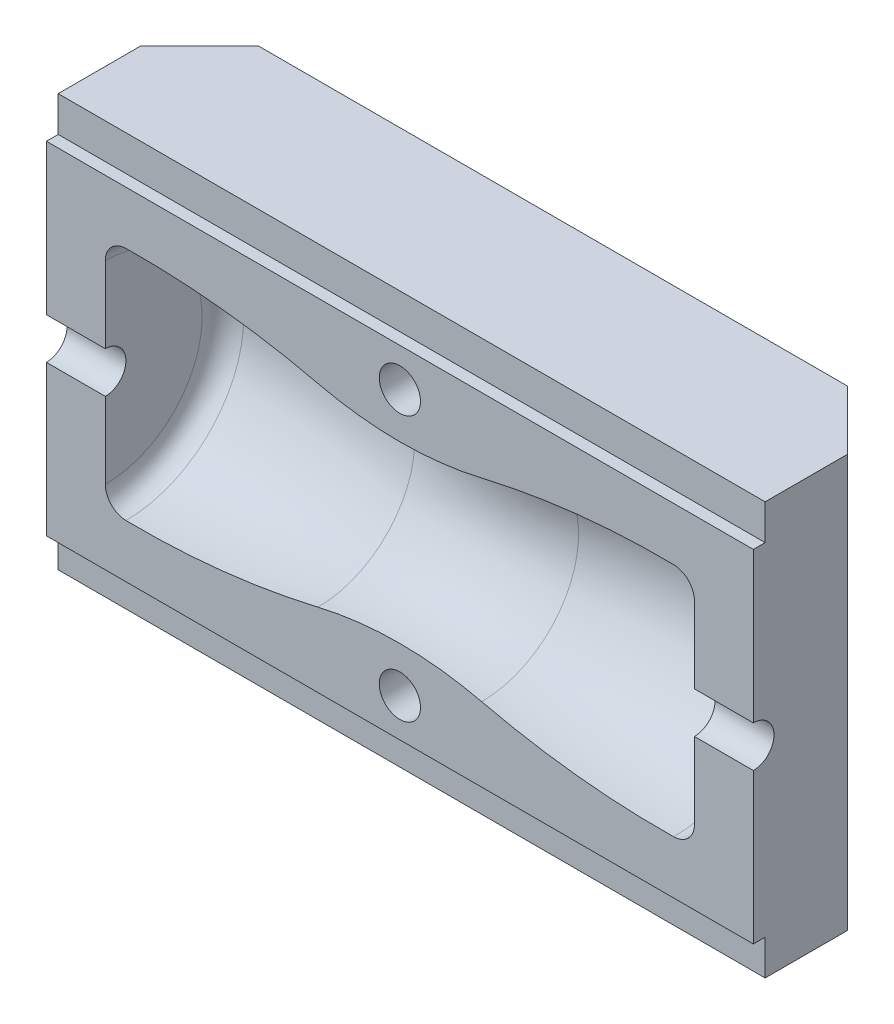
ISO-10303-21;
HEADER;
FILE_DESCRIPTION(('STEP AP214'),'2;1');
FILE_NAME('part.step','',(''),(''),'','','');
FILE_SCHEMA(('AUTOMOTIVE_DESIGN { 1 0 10303 214 1 1 1 1 }'));
ENDSEC;
DATA;
#1=APPLICATION_CONTEXT('core data for automotive mechanical design processes');
#2=APPLICATION_PROTOCOL_DEFINITION('international standard','automotive_design',2000,#1);
#3=PRODUCT_CONTEXT('',#1,'mechanical');
#4=PRODUCT('Part','Part','',(#3));
#5=PRODUCT_RELATED_PRODUCT_CATEGORY('part','',(#4));
#6=PRODUCT_DEFINITION_FORMATION('','',#4);
#7=PRODUCT_DEFINITION_CONTEXT('part definition',#1,'design');
#8=PRODUCT_DEFINITION('design','',#6,#7);
#9=PRODUCT_DEFINITION_SHAPE('','',#8);
#10=(LENGTH_UNIT() NAMED_UNIT(*) SI_UNIT(.MILLI.,.METRE.));
#11=(NAMED_UNIT(*) PLANE_ANGLE_UNIT() SI_UNIT($,.RADIAN.));
#12=(NAMED_UNIT(*) SI_UNIT($,.STERADIAN.) SOLID_ANGLE_UNIT());
#13=UNCERTAINTY_MEASURE_WITH_UNIT(LENGTH_MEASURE(1.E-05),#10,'distance_accuracy_value','');
#14=(GEOMETRIC_REPRESENTATION_CONTEXT(3) GLOBAL_UNCERTAINTY_ASSIGNED_CONTEXT((#13)) GLOBAL_UNIT_ASSIGNED_CONTEXT((#10,
#11,#12)) REPRESENTATION_CONTEXT('',''));
#15=CARTESIAN_POINT('',(0.,0.,0.));
#16=DIRECTION('',(0.,0.,1.));
#17=DIRECTION('',(1.,0.,0.));
#18=AXIS2_PLACEMENT_3D('',#15,#16,#17);
#19=CARTESIAN_POINT('',(0.,-11.25,0.));
#20=DIRECTION('',(0.,0.,1.));
#21=DIRECTION('',(1.,0.,0.));
#22=AXIS2_PLACEMENT_3D('',#19,#20,#21);
#23=CYLINDRICAL_SURFACE('',#22,1.75);
#24=CARTESIAN_POINT('',(0.,-11.25,7.49999999999999));
#25=DIRECTION('',(0.,0.,-1.));
#26=DIRECTION('',(-1.,0.,0.));
#27=AXIS2_PLACEMENT_3D('',#24,#25,#26);
#28=CIRCLE('',#27,1.75);
#29=CARTESIAN_POINT('',(1.75,-11.25,7.49999999999999));
#30=VERTEX_POINT('',#29);
#31=EDGE_CURVE('E349',#30,#30,#28,.T.);
#32=CARTESIAN_POINT('',(0.,-11.25,13.));
#33=DIRECTION('',(0.,0.,1.));
#34=DIRECTION('',(1.,0.,0.));
#35=AXIS2_PLACEMENT_3D('',#32,#33,#34);
#36=CIRCLE('',#35,1.75);
#37=CARTESIAN_POINT('',(1.75,-11.25,13.));
#38=VERTEX_POINT('',#37);
#39=EDGE_CURVE('E791',#38,#38,#36,.T.);
#40=CARTESIAN_POINT('',(1.75,-11.25,7.49999999999999));
#41=CARTESIAN_POINT('',(1.75,-11.25,7.55729166666665));
#42=CARTESIAN_POINT('',(1.75,-11.25,7.61458333333332));
#43=CARTESIAN_POINT('',(1.75,-11.25,7.72916666666665));
#44=CARTESIAN_POINT('',(1.75,-11.25,7.78645833333332));
#45=CARTESIAN_POINT('',(1.75,-11.25,7.90104166666665));
#46=CARTESIAN_POINT('',(1.75,-11.25,7.95833333333332));
#47=CARTESIAN_POINT('',(1.75,-11.25,8.07291666666665));
#48=CARTESIAN_POINT('',(1.75,-11.25,8.13020833333332));
#49=CARTESIAN_POINT('',(1.75,-11.25,8.24479166666666));
#50=CARTESIAN_POINT('',(1.75,-11.25,8.30208333333332));
#51=CARTESIAN_POINT('',(1.75,-11.25,8.41666666666666));
#52=CARTESIAN_POINT('',(1.75,-11.25,8.47395833333332));
#53=CARTESIAN_POINT('',(1.75,-11.25,8.58854166666666));
#54=CARTESIAN_POINT('',(1.75,-11.25,8.64583333333332));
#55=CARTESIAN_POINT('',(1.75,-11.25,8.76041666666666));
#56=CARTESIAN_POINT('',(1.75,-11.25,8.81770833333332));
#57=CARTESIAN_POINT('',(1.75,-11.25,8.93229166666666));
#58=CARTESIAN_POINT('',(1.75,-11.25,8.98958333333332));
#59=CARTESIAN_POINT('',(1.75,-11.25,9.10416666666666));
#60=CARTESIAN_POINT('',(1.75,-11.25,9.16145833333332));
#61=CARTESIAN_POINT('',(1.75,-11.25,9.27604166666666));
#62=CARTESIAN_POINT('',(1.75,-11.25,9.33333333333332));
#63=CARTESIAN_POINT('',(1.75,-11.25,9.44791666666666));
#64=CARTESIAN_POINT('',(1.75,-11.25,9.50520833333332));
#65=CARTESIAN_POINT('',(1.75,-11.25,9.61979166666666));
#66=CARTESIAN_POINT('',(1.75,-11.25,9.67708333333332));
#67=CARTESIAN_POINT('',(1.75,-11.25,9.79166666666666));
#68=CARTESIAN_POINT('',(1.75,-11.25,9.84895833333333));
#69=CARTESIAN_POINT('',(1.75,-11.25,9.96354166666666));
#70=CARTESIAN_POINT('',(1.75,-11.25,10.0208333333333));
#71=CARTESIAN_POINT('',(1.75,-11.25,10.1354166666667));
#72=CARTESIAN_POINT('',(1.75,-11.25,10.1927083333333));
#73=CARTESIAN_POINT('',(1.75,-11.25,10.3072916666667));
#74=CARTESIAN_POINT('',(1.75,-11.25,10.3645833333333));
#75=CARTESIAN_POINT('',(1.75,-11.25,10.4791666666667));
#76=CARTESIAN_POINT('',(1.75,-11.25,10.5364583333333));
#77=CARTESIAN_POINT('',(1.75,-11.25,10.6510416666667));
#78=CARTESIAN_POINT('',(1.75,-11.25,10.7083333333333));
#79=CARTESIAN_POINT('',(1.75,-11.25,10.8229166666667));
#80=CARTESIAN_POINT('',(1.75,-11.25,10.8802083333333));
#81=CARTESIAN_POINT('',(1.75,-11.25,10.9947916666667));
#82=CARTESIAN_POINT('',(1.75,-11.25,11.0520833333333));
#83=CARTESIAN_POINT('',(1.75,-11.25,11.1666666666667));
#84=CARTESIAN_POINT('',(1.75,-11.25,11.2239583333333));
#85=CARTESIAN_POINT('',(1.75,-11.25,11.3385416666667));
#86=CARTESIAN_POINT('',(1.75,-11.25,11.3958333333333));
#87=CARTESIAN_POINT('',(1.75,-11.25,11.5104166666667));
#88=CARTESIAN_POINT('',(1.75,-11.25,11.5677083333333));
#89=CARTESIAN_POINT('',(1.75,-11.25,11.6822916666667));
#90=CARTESIAN_POINT('',(1.75,-11.25,11.7395833333333));
#91=CARTESIAN_POINT('',(1.75,-11.25,11.8541666666667));
#92=CARTESIAN_POINT('',(1.75,-11.25,11.9114583333333));
#93=CARTESIAN_POINT('',(1.75,-11.25,12.0260416666667));
#94=CARTESIAN_POINT('',(1.75,-11.25,12.0833333333333));
#95=CARTESIAN_POINT('',(1.75,-11.25,12.1979166666667));
#96=CARTESIAN_POINT('',(1.75,-11.25,12.2552083333333));
#97=CARTESIAN_POINT('',(1.75,-11.25,12.3697916666667));
#98=CARTESIAN_POINT('',(1.75,-11.25,12.4270833333333));
#99=CARTESIAN_POINT('',(1.75,-11.25,12.5416666666667));
#100=CARTESIAN_POINT('',(1.75,-11.25,12.5989583333333));
#101=CARTESIAN_POINT('',(1.75,-11.25,12.7135416666667));
#102=CARTESIAN_POINT('',(1.75,-11.25,12.7708333333333));
#103=CARTESIAN_POINT('',(1.75,-11.25,12.8854166666667));
#104=CARTESIAN_POINT('',(1.75,-11.25,12.9427083333333));
#105=CARTESIAN_POINT('',(1.75,-11.25,13.));
#106=B_SPLINE_CURVE_WITH_KNOTS('',3,(#40,#41,#42,#43,#44,#45,#46,#47,#48,#49,#50,#51,#52,#53,
#54,#55,#56,#57,#58,#59,#60,#61,#62,#63,#64,#65,#66,#67,#68,#69,#70,#71,#72,#73,#74,#75,#76,#77,
#78,#79,#80,#81,#82,#83,#84,#85,#86,#87,#88,#89,#90,#91,#92,#93,#94,#95,#96,#97,#98,#99,#100,
#101,#102,#103,#104,#105),.UNSPECIFIED.,.F.,.F.,(4,2,2,2,2,2,2,2,2,2,2,2,2,2,2,2,2,2,2,2,2,2,2,
2,2,2,2,2,2,2,2,2,4),(0.,0.171875,0.343749999999999,0.515625,0.687500000000001,
0.859375000000002,1.03125,1.203125,1.375,1.546875,1.71875,1.890625,2.0625,2.234375,2.40625,
2.578125,2.75000000000001,2.92187500000001,3.09375000000001,3.26562500000001,3.43750000000001,
3.60937500000001,3.78125000000001,3.95312500000001,4.12500000000001,4.29687500000001,
4.46875000000001,4.64062500000001,4.81250000000001,4.98437500000001,5.15625000000001,
5.32812500000001,5.50000000000001),.UNSPECIFIED.);
#107=EDGE_CURVE('BSEAM39',#30,#38,#106,.T.);
#108=ORIENTED_EDGE('',*,*,#31,.T.);
#109=ORIENTED_EDGE('',*,*,#39,.T.);
#110=ORIENTED_EDGE('',*,*,#107,.T.);
#111=ORIENTED_EDGE('',*,*,#107,.F.);
#112=EDGE_LOOP('',(#108,#110,#109,#111));
#113=FACE_BOUND('',#112,.T.);
#114=ADVANCED_FACE('F39',(#113),#23,.F.);
#115=CARTESIAN_POINT('',(0.,11.25,0.));
#116=DIRECTION('',(0.,0.,1.));
#117=DIRECTION('',(1.,0.,0.));
#118=AXIS2_PLACEMENT_3D('',#115,#116,#117);
#119=CYLINDRICAL_SURFACE('',#118,1.75);
#120=CARTESIAN_POINT('',(0.,11.25,7.49999999999999));
#121=DIRECTION('',(0.,0.,-1.));
#122=DIRECTION('',(-1.,0.,0.));
#123=AXIS2_PLACEMENT_3D('',#120,#121,#122);
#124=CIRCLE('',#123,1.75);
#125=CARTESIAN_POINT('',(1.75,11.25,7.49999999999999));
#126=VERTEX_POINT('',#125);
#127=EDGE_CURVE('E334',#126,#126,#124,.T.);
#128=CARTESIAN_POINT('',(0.,11.25,13.));
#129=DIRECTION('',(0.,0.,1.));
#130=DIRECTION('',(1.,0.,0.));
#131=AXIS2_PLACEMENT_3D('',#128,#129,#130);
#132=CIRCLE('',#131,1.75);
#133=CARTESIAN_POINT('',(1.75,11.25,13.));
#134=VERTEX_POINT('',#133);
#135=EDGE_CURVE('E217',#134,#134,#132,.T.);
#136=CARTESIAN_POINT('',(1.75,11.25,7.49999999999999));
#137=CARTESIAN_POINT('',(1.75,11.25,7.55729166666665));
#138=CARTESIAN_POINT('',(1.75,11.25,7.61458333333332));
#139=CARTESIAN_POINT('',(1.75,11.25,7.72916666666665));
#140=CARTESIAN_POINT('',(1.75,11.25,7.78645833333332));
#141=CARTESIAN_POINT('',(1.75,11.25,7.90104166666665));
#142=CARTESIAN_POINT('',(1.75,11.25,7.95833333333332));
#143=CARTESIAN_POINT('',(1.75,11.25,8.07291666666665));
#144=CARTESIAN_POINT('',(1.75,11.25,8.13020833333332));
#145=CARTESIAN_POINT('',(1.75,11.25,8.24479166666666));
#146=CARTESIAN_POINT('',(1.75,11.25,8.30208333333332));
#147=CARTESIAN_POINT('',(1.75,11.25,8.41666666666666));
#148=CARTESIAN_POINT('',(1.75,11.25,8.47395833333332));
#149=CARTESIAN_POINT('',(1.75,11.25,8.58854166666666));
#150=CARTESIAN_POINT('',(1.75,11.25,8.64583333333332));
#151=CARTESIAN_POINT('',(1.75,11.25,8.76041666666666));
#152=CARTESIAN_POINT('',(1.75,11.25,8.81770833333332));
#153=CARTESIAN_POINT('',(1.75,11.25,8.93229166666666));
#154=CARTESIAN_POINT('',(1.75,11.25,8.98958333333332));
#155=CARTESIAN_POINT('',(1.75,11.25,9.10416666666666));
#156=CARTESIAN_POINT('',(1.75,11.25,9.16145833333332));
#157=CARTESIAN_POINT('',(1.75,11.25,9.27604166666666));
#158=CARTESIAN_POINT('',(1.75,11.25,9.33333333333332));
#159=CARTESIAN_POINT('',(1.75,11.25,9.44791666666666));
#160=CARTESIAN_POINT('',(1.75,11.25,9.50520833333332));
#161=CARTESIAN_POINT('',(1.75,11.25,9.61979166666666));
#162=CARTESIAN_POINT('',(1.75,11.25,9.67708333333332));
#163=CARTESIAN_POINT('',(1.75,11.25,9.79166666666666));
#164=CARTESIAN_POINT('',(1.75,11.25,9.84895833333333));
#165=CARTESIAN_POINT('',(1.75,11.25,9.96354166666666));
#166=CARTESIAN_POINT('',(1.75,11.25,10.0208333333333));
#167=CARTESIAN_POINT('',(1.75,11.25,10.1354166666667));
#168=CARTESIAN_POINT('',(1.75,11.25,10.1927083333333));
#169=CARTESIAN_POINT('',(1.75,11.25,10.3072916666667));
#170=CARTESIAN_POINT('',(1.75,11.25,10.3645833333333));
#171=CARTESIAN_POINT('',(1.75,11.25,10.4791666666667));
#172=CARTESIAN_POINT('',(1.75,11.25,10.5364583333333));
#173=CARTESIAN_POINT('',(1.75,11.25,10.6510416666667));
#174=CARTESIAN_POINT('',(1.75,11.25,10.7083333333333));
#175=CARTESIAN_POINT('',(1.75,11.25,10.8229166666667));
#176=CARTESIAN_POINT('',(1.75,11.25,10.8802083333333));
#177=CARTESIAN_POINT('',(1.75,11.25,10.9947916666667));
#178=CARTESIAN_POINT('',(1.75,11.25,11.0520833333333));
#179=CARTESIAN_POINT('',(1.75,11.25,11.1666666666667));
#180=CARTESIAN_POINT('',(1.75,11.25,11.2239583333333));
#181=CARTESIAN_POINT('',(1.75,11.25,11.3385416666667));
#182=CARTESIAN_POINT('',(1.75,11.25,11.3958333333333));
#183=CARTESIAN_POINT('',(1.75,11.25,11.5104166666667));
#184=CARTESIAN_POINT('',(1.75,11.25,11.5677083333333));
#185=CARTESIAN_POINT('',(1.75,11.25,11.6822916666667));
#186=CARTESIAN_POINT('',(1.75,11.25,11.7395833333333));
#187=CARTESIAN_POINT('',(1.75,11.25,11.8541666666667));
#188=CARTESIAN_POINT('',(1.75,11.25,11.9114583333333));
#189=CARTESIAN_POINT('',(1.75,11.25,12.0260416666667));
#190=CARTESIAN_POINT('',(1.75,11.25,12.0833333333333));
#191=CARTESIAN_POINT('',(1.75,11.25,12.1979166666667));
#192=CARTESIAN_POINT('',(1.75,11.25,12.2552083333333));
#193=CARTESIAN_POINT('',(1.75,11.25,12.3697916666667));
#194=CARTESIAN_POINT('',(1.75,11.25,12.4270833333333));
#195=CARTESIAN_POINT('',(1.75,11.25,12.5416666666667));
#196=CARTESIAN_POINT('',(1.75,11.25,12.5989583333333));
#197=CARTESIAN_POINT('',(1.75,11.25,12.7135416666667));
#198=CARTESIAN_POINT('',(1.75,11.25,12.7708333333333));
#199=CARTESIAN_POINT('',(1.75,11.25,12.8854166666667));
#200=CARTESIAN_POINT('',(1.75,11.25,12.9427083333333));
#201=CARTESIAN_POINT('',(1.75,11.25,13.));
#202=B_SPLINE_CURVE_WITH_KNOTS('',3,(#136,#137,#138,#139,#140,#141,#142,#143,#144,#145,#146,
#147,#148,#149,#150,#151,#152,#153,#154,#155,#156,#157,#158,#159,#160,#161,#162,#163,#164,#165,
#166,#167,#168,#169,#170,#171,#172,#173,#174,#175,#176,#177,#178,#179,#180,#181,#182,#183,#184,
#185,#186,#187,#188,#189,#190,#191,#192,#193,#194,#195,#196,#197,#198,#199,#200,#201),
.UNSPECIFIED.,.F.,.F.,(4,2,2,2,2,2,2,2,2,2,2,2,2,2,2,2,2,2,2,2,2,2,2,2,2,2,2,2,2,2,2,2,4),(0.,
0.171875,0.343749999999999,0.515625,0.687500000000001,0.859375000000002,1.03125,1.203125,1.375,
1.546875,1.71875,1.890625,2.0625,2.234375,2.40625,2.578125,2.75000000000001,2.92187500000001,
3.09375000000001,3.26562500000001,3.43750000000001,3.60937500000001,3.78125000000001,
3.95312500000001,4.12500000000001,4.29687500000001,4.46875000000001,4.64062500000001,
4.81250000000001,4.98437500000001,5.15625000000001,5.32812500000001,5.50000000000001),.UNSPECIFIED.);
#203=EDGE_CURVE('BSEAM385',#126,#134,#202,.T.);
#204=ORIENTED_EDGE('',*,*,#127,.T.);
#205=ORIENTED_EDGE('',*,*,#135,.T.);
#206=ORIENTED_EDGE('',*,*,#203,.T.);
#207=ORIENTED_EDGE('',*,*,#203,.F.);
#208=EDGE_LOOP('',(#204,#206,#205,#207));
#209=FACE_BOUND('',#208,.T.);
#210=ADVANCED_FACE('F385',(#209),#119,.F.);
#211=CARTESIAN_POINT('',(-30.,17.5,13.));
#212=DIRECTION('',(0.,-1.,0.));
#213=DIRECTION('',(0.,0.,-1.));
#214=AXIS2_PLACEMENT_3D('',#211,#212,#213);
#215=PLANE('',#214);
#216=DIRECTION('',(0.,0.,-1.));
#217=VECTOR('',#216,1.);
#218=CARTESIAN_POINT('',(30.,17.5,13.));
#219=LINE('',#218,#217);
#220=CARTESIAN_POINT('',(30.,17.5,12.));
#221=VERTEX_POINT('',#220);
#222=CARTESIAN_POINT('',(30.,17.5,5.00000000000001));
#223=VERTEX_POINT('',#222);
#224=EDGE_CURVE('E278',#221,#223,#219,.T.);
#225=ORIENTED_EDGE('',*,*,#224,.T.);
#226=DIRECTION('',(0.707106781186549,0.,0.707106781186546));
#227=VECTOR('',#226,1.);
#228=CARTESIAN_POINT('',(30.,17.5,5.));
#229=LINE('',#228,#227);
#230=CARTESIAN_POINT('',(25.,17.5,0.));
#231=VERTEX_POINT('',#230);
#232=EDGE_CURVE('E318',#223,#231,#229,.F.);
#233=ORIENTED_EDGE('',*,*,#232,.T.);
#234=DIRECTION('',(-1.,0.,0.));
#235=VECTOR('',#234,1.);
#236=CARTESIAN_POINT('',(-30.,17.5,0.));
#237=LINE('',#236,#235);
#238=CARTESIAN_POINT('',(-25.,17.5,0.));
#239=VERTEX_POINT('',#238);
#240=EDGE_CURVE('E260',#231,#239,#237,.T.);
#241=ORIENTED_EDGE('',*,*,#240,.T.);
#242=DIRECTION('',(0.707106781186548,0.,-0.707106781186547));
#243=VECTOR('',#242,1.);
#244=CARTESIAN_POINT('',(-30.,17.5,5.));
#245=LINE('',#244,#243);
#246=CARTESIAN_POINT('',(-30.,17.5,5.00000000000001));
#247=VERTEX_POINT('',#246);
#248=EDGE_CURVE('E316',#239,#247,#245,.F.);
#249=ORIENTED_EDGE('',*,*,#248,.T.);
#250=DIRECTION('',(0.,0.,-1.));
#251=VECTOR('',#250,1.);
#252=CARTESIAN_POINT('',(-30.,17.5,13.));
#253=LINE('',#252,#251);
#254=CARTESIAN_POINT('',(-30.,17.5,12.));
#255=VERTEX_POINT('',#254);
#256=EDGE_CURVE('E276',#255,#247,#253,.T.);
#257=ORIENTED_EDGE('',*,*,#256,.F.);
#258=DIRECTION('',(-1.,0.,0.));
#259=VECTOR('',#258,1.);
#260=CARTESIAN_POINT('',(-30.,17.5,12.));
#261=LINE('',#260,#259);
#262=EDGE_CURVE('E195',#221,#255,#261,.T.);
#263=ORIENTED_EDGE('',*,*,#262,.F.);
#264=EDGE_LOOP('',(#225,#233,#241,#249,#257,#263));
#265=FACE_BOUND('',#264,.T.);
#266=ADVANCED_FACE('F392',(#265),#215,.F.);
#267=CARTESIAN_POINT('',(-30.,-17.5,13.));
#268=DIRECTION('',(0.,1.,0.));
#269=DIRECTION('',(0.,0.,1.));
#270=AXIS2_PLACEMENT_3D('',#267,#268,#269);
#271=PLANE('',#270);
#272=DIRECTION('',(1.,0.,0.));
#273=VECTOR('',#272,1.);
#274=CARTESIAN_POINT('',(-30.,-17.5,0.));
#275=LINE('',#274,#273);
#276=CARTESIAN_POINT('',(-25.,-17.5,0.));
#277=VERTEX_POINT('',#276);
#278=CARTESIAN_POINT('',(25.,-17.5,0.));
#279=VERTEX_POINT('',#278);
#280=EDGE_CURVE('E269',#277,#279,#275,.T.);
#281=ORIENTED_EDGE('',*,*,#280,.T.);
#282=DIRECTION('',(-0.707106781186549,0.,-0.707106781186546));
#283=VECTOR('',#282,1.);
#284=CARTESIAN_POINT('',(30.,-17.5,5.));
#285=LINE('',#284,#283);
#286=CARTESIAN_POINT('',(30.,-17.5,5.00000000000001));
#287=VERTEX_POINT('',#286);
#288=EDGE_CURVE('E324',#279,#287,#285,.F.);
#289=ORIENTED_EDGE('',*,*,#288,.T.);
#290=DIRECTION('',(0.,0.,-1.));
#291=VECTOR('',#290,1.);
#292=CARTESIAN_POINT('',(30.,-17.5,13.));
#293=LINE('',#292,#291);
#294=CARTESIAN_POINT('',(30.,-17.5,12.));
#295=VERTEX_POINT('',#294);
#296=EDGE_CURVE('E266',#295,#287,#293,.T.);
#297=ORIENTED_EDGE('',*,*,#296,.F.);
#298=DIRECTION('',(1.,0.,0.));
#299=VECTOR('',#298,1.);
#300=CARTESIAN_POINT('',(30.,-17.5,12.));
#301=LINE('',#300,#299);
#302=CARTESIAN_POINT('',(-30.,-17.5,12.));
#303=VERTEX_POINT('',#302);
#304=EDGE_CURVE('E213',#303,#295,#301,.T.);
#305=ORIENTED_EDGE('',*,*,#304,.F.);
#306=DIRECTION('',(0.,0.,-1.));
#307=VECTOR('',#306,1.);
#308=CARTESIAN_POINT('',(-30.,-17.5,13.));
#309=LINE('',#308,#307);
#310=CARTESIAN_POINT('',(-30.,-17.5,5.00000000000001));
#311=VERTEX_POINT('',#310);
#312=EDGE_CURVE('E273',#303,#311,#309,.T.);
#313=ORIENTED_EDGE('',*,*,#312,.T.);
#314=DIRECTION('',(-0.707106781186548,0.,0.707106781186547));
#315=VECTOR('',#314,1.);
#316=CARTESIAN_POINT('',(-30.,-17.5,5.));
#317=LINE('',#316,#315);
#318=EDGE_CURVE('E55',#311,#277,#317,.F.);
#319=ORIENTED_EDGE('',*,*,#318,.T.);
#320=EDGE_LOOP('',(#281,#289,#297,#305,#313,#319));
#321=FACE_BOUND('',#320,.T.);
#322=ADVANCED_FACE('F451',(#321),#271,.F.);
#323=CARTESIAN_POINT('',(0.,0.,13.));
#324=DIRECTION('',(0.,0.,1.));
#325=DIRECTION('',(1.,0.,0.));
#326=AXIS2_PLACEMENT_3D('',#323,#324,#325);
#327=PLANE('',#326);
#328=ORIENTED_EDGE('',*,*,#39,.F.);
#329=EDGE_LOOP('',(#328));
#330=FACE_BOUND('',#329,.T.);
#331=DIRECTION('',(-1.,0.,0.));
#332=VECTOR('',#331,1.);
#333=CARTESIAN_POINT('',(30.,-14.5,13.));
#334=LINE('',#333,#332);
#335=CARTESIAN_POINT('',(30.,-14.5,13.));
#336=VERTEX_POINT('',#335);
#337=CARTESIAN_POINT('',(-30.,-14.5,13.));
#338=VERTEX_POINT('',#337);
#339=EDGE_CURVE('E218',#336,#338,#334,.T.);
#340=ORIENTED_EDGE('',*,*,#339,.F.);
#341=DIRECTION('',(0.,1.,0.));
#342=VECTOR('',#341,1.);
#343=CARTESIAN_POINT('',(30.,17.5,13.));
#344=LINE('',#343,#342);
#345=CARTESIAN_POINT('',(30.,-1.75000000000001,13.));
#346=VERTEX_POINT('',#345);
#347=EDGE_CURVE('E261',#336,#346,#344,.T.);
#348=ORIENTED_EDGE('',*,*,#347,.T.);
#349=DIRECTION('',(1.,0.,0.));
#350=VECTOR('',#349,1.);
#351=CARTESIAN_POINT('',(-30.,-1.75000000000002,13.));
#352=LINE('',#351,#350);
#353=CARTESIAN_POINT('',(25.,-1.75000000000001,13.));
#354=VERTEX_POINT('',#353);
#355=EDGE_CURVE('E234',#354,#346,#352,.T.);
#356=ORIENTED_EDGE('',*,*,#355,.F.);
#357=DIRECTION('',(0.,1.,0.));
#358=VECTOR('',#357,1.);
#359=CARTESIAN_POINT('',(25.,0.,13.));
#360=LINE('',#359,#358);
#361=CARTESIAN_POINT('',(25.,-8.21812745520263,13.));
#362=VERTEX_POINT('',#361);
#363=EDGE_CURVE('E282',#362,#354,#360,.T.);
#364=ORIENTED_EDGE('',*,*,#363,.F.);
#365=CARTESIAN_POINT('',(23.217947805922,-8.21812745520263,13.));
#366=DIRECTION('',(0.,0.,1.));
#367=DIRECTION('',(1.,0.,0.));
#368=AXIS2_PLACEMENT_3D('',#365,#366,#367);
#369=CIRCLE('',#368,1.782052194078);
#370=CARTESIAN_POINT('',(23.2432510965285,-10.,13.));
#371=VERTEX_POINT('',#370);
#372=EDGE_CURVE('E287',#371,#362,#369,.T.);
#373=ORIENTED_EDGE('',*,*,#372,.F.);
#374=CARTESIAN_POINT('',(22.2956280625294,56.7321690826381,13.));
#375=DIRECTION('',(0.,0.,1.));
#376=DIRECTION('',(1.,0.,0.));
#377=AXIS2_PLACEMENT_3D('',#374,#375,#376);
#378=CIRCLE('',#377,66.7388970532805);
#379=CARTESIAN_POINT('',(6.94833645993956,-8.21812745520262,13.));
#380=VERTEX_POINT('',#379);
#381=EDGE_CURVE('E292',#380,#371,#378,.T.);
#382=ORIENTED_EDGE('',*,*,#381,.F.);
#383=CARTESIAN_POINT('',(0.,-37.6237401980803,13.));
#384=DIRECTION('',(0.,0.,1.));
#385=DIRECTION('',(1.,0.,0.));
#386=AXIS2_PLACEMENT_3D('',#383,#384,#385);
#387=CIRCLE('',#386,30.2153841667555);
#388=CARTESIAN_POINT('',(-6.94833645993959,-8.21812745520262,13.));
#389=VERTEX_POINT('',#388);
#390=EDGE_CURVE('E296',#389,#380,#387,.F.);
#391=ORIENTED_EDGE('',*,*,#390,.F.);
#392=CARTESIAN_POINT('',(-22.2956280625294,56.7321690826381,13.));
#393=DIRECTION('',(0.,0.,1.));
#394=DIRECTION('',(1.,0.,0.));
#395=AXIS2_PLACEMENT_3D('',#392,#393,#394);
#396=CIRCLE('',#395,66.7388970532805);
#397=CARTESIAN_POINT('',(-23.2432510965285,-10.,13.));
#398=VERTEX_POINT('',#397);
#399=EDGE_CURVE('E300',#398,#389,#396,.T.);
#400=ORIENTED_EDGE('',*,*,#399,.F.);
#401=CARTESIAN_POINT('',(-23.217947805922,-8.21812745520263,13.));
#402=DIRECTION('',(0.,0.,1.));
#403=DIRECTION('',(1.,0.,0.));
#404=AXIS2_PLACEMENT_3D('',#401,#402,#403);
#405=CIRCLE('',#404,1.782052194078);
#406=CARTESIAN_POINT('',(-25.,-8.21812745520263,13.));
#407=VERTEX_POINT('',#406);
#408=EDGE_CURVE('E304',#407,#398,#405,.T.);
#409=ORIENTED_EDGE('',*,*,#408,.F.);
#410=DIRECTION('',(0.,-1.,0.));
#411=VECTOR('',#410,1.);
#412=CARTESIAN_POINT('',(-25.,0.,13.));
#413=LINE('',#412,#411);
#414=CARTESIAN_POINT('',(-25.,-1.75000000000002,13.));
#415=VERTEX_POINT('',#414);
#416=EDGE_CURVE('E306',#415,#407,#413,.T.);
#417=ORIENTED_EDGE('',*,*,#416,.F.);
#418=CARTESIAN_POINT('',(-30.,-1.75000000000002,13.));
#419=VERTEX_POINT('',#418);
#420=EDGE_CURVE('E239',#419,#415,#352,.T.);
#421=ORIENTED_EDGE('',*,*,#420,.F.);
#422=DIRECTION('',(0.,-1.,0.));
#423=VECTOR('',#422,1.);
#424=CARTESIAN_POINT('',(-30.,17.5,13.));
#425=LINE('',#424,#423);
#426=EDGE_CURVE('E263',#419,#338,#425,.T.);
#427=ORIENTED_EDGE('',*,*,#426,.T.);
#428=EDGE_LOOP('',(#340,#348,#356,#364,#373,#382,#391,#400,#409,#417,#421,#427));
#429=FACE_BOUND('',#428,.T.);
#430=ADVANCED_FACE('F447',(#330,#429),#327,.T.);
#431=CARTESIAN_POINT('',(30.,17.5,13.));
#432=DIRECTION('',(-1.,0.,0.));
#433=DIRECTION('',(0.,-1.,0.));
#434=AXIS2_PLACEMENT_3D('',#431,#432,#433);
#435=PLANE('',#434);
#436=ORIENTED_EDGE('',*,*,#296,.T.);
#437=DIRECTION('',(0.,1.,0.));
#438=VECTOR('',#437,1.);
#439=CARTESIAN_POINT('',(30.,17.5,5.));
#440=LINE('',#439,#438);
#441=EDGE_CURVE('E313',#287,#223,#440,.T.);
#442=ORIENTED_EDGE('',*,*,#441,.T.);
#443=ORIENTED_EDGE('',*,*,#224,.F.);
#444=DIRECTION('',(0.,1.,0.));
#445=VECTOR('',#444,1.);
#446=CARTESIAN_POINT('',(30.,17.5,12.));
#447=LINE('',#446,#445);
#448=CARTESIAN_POINT('',(30.,14.5,12.));
#449=VERTEX_POINT('',#448);
#450=EDGE_CURVE('E189',#449,#221,#447,.T.);
#451=ORIENTED_EDGE('',*,*,#450,.F.);
#452=DIRECTION('',(0.,0.,1.));
#453=VECTOR('',#452,1.);
#454=CARTESIAN_POINT('',(30.,14.5,12.));
#455=LINE('',#454,#453);
#456=CARTESIAN_POINT('',(30.,14.5,13.));
#457=VERTEX_POINT('',#456);
#458=EDGE_CURVE('E186',#449,#457,#455,.T.);
#459=ORIENTED_EDGE('',*,*,#458,.T.);
#460=CARTESIAN_POINT('',(30.,1.75,13.));
#461=VERTEX_POINT('',#460);
#462=EDGE_CURVE('E264',#461,#457,#344,.T.);
#463=ORIENTED_EDGE('',*,*,#462,.F.);
#464=CARTESIAN_POINT('',(30.,0.,13.));
#465=DIRECTION('',(1.,0.,0.));
#466=DIRECTION('',(0.,1.,0.));
#467=AXIS2_PLACEMENT_3D('',#464,#465,#466);
#468=CIRCLE('',#467,1.75);
#469=EDGE_CURVE('E206',#346,#461,#468,.T.);
#470=ORIENTED_EDGE('',*,*,#469,.F.);
#471=ORIENTED_EDGE('',*,*,#347,.F.);
#472=DIRECTION('',(0.,0.,1.));
#473=VECTOR('',#472,1.);
#474=CARTESIAN_POINT('',(30.,-14.5,12.));
#475=LINE('',#474,#473);
#476=CARTESIAN_POINT('',(30.,-14.5,12.));
#477=VERTEX_POINT('',#476);
#478=EDGE_CURVE('E211',#477,#336,#475,.T.);
#479=ORIENTED_EDGE('',*,*,#478,.F.);
#480=DIRECTION('',(0.,1.,0.));
#481=VECTOR('',#480,1.);
#482=CARTESIAN_POINT('',(30.,-17.5,12.));
#483=LINE('',#482,#481);
#484=EDGE_CURVE('E220',#295,#477,#483,.T.);
#485=ORIENTED_EDGE('',*,*,#484,.F.);
#486=EDGE_LOOP('',(#436,#442,#443,#451,#459,#463,#470,#471,#479,#485));
#487=FACE_BOUND('',#486,.T.);
#488=ADVANCED_FACE('F457',(#487),#435,.F.);
#489=CARTESIAN_POINT('',(-30.,17.5,13.));
#490=DIRECTION('',(1.,0.,0.));
#491=DIRECTION('',(0.,0.,-1.));
#492=AXIS2_PLACEMENT_3D('',#489,#490,#491);
#493=PLANE('',#492);
#494=ORIENTED_EDGE('',*,*,#256,.T.);
#495=DIRECTION('',(0.,-1.,0.));
#496=VECTOR('',#495,1.);
#497=CARTESIAN_POINT('',(-30.,17.5,5.));
#498=LINE('',#497,#496);
#499=EDGE_CURVE('E326',#247,#311,#498,.T.);
#500=ORIENTED_EDGE('',*,*,#499,.T.);
#501=ORIENTED_EDGE('',*,*,#312,.F.);
#502=DIRECTION('',(0.,-1.,0.));
#503=VECTOR('',#502,1.);
#504=CARTESIAN_POINT('',(-30.,-17.5,12.));
#505=LINE('',#504,#503);
#506=CARTESIAN_POINT('',(-30.,-14.5,12.));
#507=VERTEX_POINT('',#506);
#508=EDGE_CURVE('E222',#507,#303,#505,.T.);
#509=ORIENTED_EDGE('',*,*,#508,.F.);
#510=DIRECTION('',(0.,0.,1.));
#511=VECTOR('',#510,1.);
#512=CARTESIAN_POINT('',(-30.,-14.5,12.));
#513=LINE('',#512,#511);
#514=EDGE_CURVE('E214',#507,#338,#513,.T.);
#515=ORIENTED_EDGE('',*,*,#514,.T.);
#516=ORIENTED_EDGE('',*,*,#426,.F.);
#517=CARTESIAN_POINT('',(-30.,0.,13.));
#518=DIRECTION('',(1.,0.,0.));
#519=DIRECTION('',(0.,1.,0.));
#520=AXIS2_PLACEMENT_3D('',#517,#518,#519);
#521=CIRCLE('',#520,1.75);
#522=CARTESIAN_POINT('',(-30.,1.74999999999998,13.));
#523=VERTEX_POINT('',#522);
#524=EDGE_CURVE('E229',#419,#523,#521,.T.);
#525=ORIENTED_EDGE('',*,*,#524,.T.);
#526=CARTESIAN_POINT('',(-30.,14.5,13.));
#527=VERTEX_POINT('',#526);
#528=EDGE_CURVE('E204',#527,#523,#425,.T.);
#529=ORIENTED_EDGE('',*,*,#528,.F.);
#530=DIRECTION('',(0.,0.,1.));
#531=VECTOR('',#530,1.);
#532=CARTESIAN_POINT('',(-30.,14.5,12.));
#533=LINE('',#532,#531);
#534=CARTESIAN_POINT('',(-30.,14.5,12.));
#535=VERTEX_POINT('',#534);
#536=EDGE_CURVE('E183',#535,#527,#533,.T.);
#537=ORIENTED_EDGE('',*,*,#536,.F.);
#538=DIRECTION('',(0.,-1.,0.));
#539=VECTOR('',#538,1.);
#540=CARTESIAN_POINT('',(-30.,17.5,12.));
#541=LINE('',#540,#539);
#542=EDGE_CURVE('E190',#255,#535,#541,.T.);
#543=ORIENTED_EDGE('',*,*,#542,.F.);
#544=EDGE_LOOP('',(#494,#500,#501,#509,#515,#516,#525,#529,#537,#543));
#545=FACE_BOUND('',#544,.T.);
#546=ADVANCED_FACE('F202',(#545),#493,.F.);
#547=ORIENTED_EDGE('',*,*,#135,.F.);
#548=EDGE_LOOP('',(#547));
#549=FACE_BOUND('',#548,.T.);
#550=DIRECTION('',(1.,0.,0.));
#551=VECTOR('',#550,1.);
#552=CARTESIAN_POINT('',(-30.,14.5,13.));
#553=LINE('',#552,#551);
#554=EDGE_CURVE('E199',#527,#457,#553,.T.);
#555=ORIENTED_EDGE('',*,*,#554,.F.);
#556=ORIENTED_EDGE('',*,*,#528,.T.);
#557=DIRECTION('',(1.,0.,0.));
#558=VECTOR('',#557,1.);
#559=CARTESIAN_POINT('',(-30.,1.74999999999998,13.));
#560=LINE('',#559,#558);
#561=CARTESIAN_POINT('',(-25.,1.74999999999998,13.));
#562=VERTEX_POINT('',#561);
#563=EDGE_CURVE('E235',#562,#523,#560,.F.);
#564=ORIENTED_EDGE('',*,*,#563,.F.);
#565=CARTESIAN_POINT('',(-25.,8.21812745520262,13.));
#566=VERTEX_POINT('',#565);
#567=EDGE_CURVE('E307',#566,#562,#413,.T.);
#568=ORIENTED_EDGE('',*,*,#567,.F.);
#569=CARTESIAN_POINT('',(-23.217947805922,8.21812745520262,13.));
#570=DIRECTION('',(0.,0.,1.));
#571=DIRECTION('',(1.,0.,0.));
#572=AXIS2_PLACEMENT_3D('',#569,#570,#571);
#573=CIRCLE('',#572,1.782052194078);
#574=CARTESIAN_POINT('',(-23.2432510965285,10.,13.));
#575=VERTEX_POINT('',#574);
#576=EDGE_CURVE('E302',#575,#566,#573,.T.);
#577=ORIENTED_EDGE('',*,*,#576,.F.);
#578=CARTESIAN_POINT('',(-22.2956280625294,-56.7321690826381,13.));
#579=DIRECTION('',(0.,0.,1.));
#580=DIRECTION('',(1.,0.,0.));
#581=AXIS2_PLACEMENT_3D('',#578,#579,#580);
#582=CIRCLE('',#581,66.7388970532805);
#583=CARTESIAN_POINT('',(-6.94833645993959,8.21812745520262,13.));
#584=VERTEX_POINT('',#583);
#585=EDGE_CURVE('E298',#584,#575,#582,.T.);
#586=ORIENTED_EDGE('',*,*,#585,.F.);
#587=CARTESIAN_POINT('',(0.,37.6237401980803,13.));
#588=DIRECTION('',(0.,0.,1.));
#589=DIRECTION('',(1.,0.,0.));
#590=AXIS2_PLACEMENT_3D('',#587,#588,#589);
#591=CIRCLE('',#590,30.2153841667555);
#592=CARTESIAN_POINT('',(6.94833645993956,8.21812745520262,13.));
#593=VERTEX_POINT('',#592);
#594=EDGE_CURVE('E294',#593,#584,#591,.F.);
#595=ORIENTED_EDGE('',*,*,#594,.F.);
#596=CARTESIAN_POINT('',(22.2956280625294,-56.7321690826381,13.));
#597=DIRECTION('',(0.,0.,1.));
#598=DIRECTION('',(1.,0.,0.));
#599=AXIS2_PLACEMENT_3D('',#596,#597,#598);
#600=CIRCLE('',#599,66.7388970532805);
#601=CARTESIAN_POINT('',(23.2432510965285,10.,13.));
#602=VERTEX_POINT('',#601);
#603=EDGE_CURVE('E290',#602,#593,#600,.T.);
#604=ORIENTED_EDGE('',*,*,#603,.F.);
#605=CARTESIAN_POINT('',(23.217947805922,8.21812745520263,13.));
#606=DIRECTION('',(0.,0.,1.));
#607=DIRECTION('',(1.,0.,0.));
#608=AXIS2_PLACEMENT_3D('',#605,#606,#607);
#609=CIRCLE('',#608,1.782052194078);
#610=CARTESIAN_POINT('',(25.,8.21812745520263,13.));
#611=VERTEX_POINT('',#610);
#612=EDGE_CURVE('E285',#611,#602,#609,.T.);
#613=ORIENTED_EDGE('',*,*,#612,.F.);
#614=CARTESIAN_POINT('',(25.,1.74999999999999,13.));
#615=VERTEX_POINT('',#614);
#616=EDGE_CURVE('E281',#615,#611,#360,.T.);
#617=ORIENTED_EDGE('',*,*,#616,.F.);
#618=EDGE_CURVE('E231',#461,#615,#560,.F.);
#619=ORIENTED_EDGE('',*,*,#618,.F.);
#620=ORIENTED_EDGE('',*,*,#462,.T.);
#621=EDGE_LOOP('',(#555,#556,#564,#568,#577,#586,#595,#604,#613,#617,#619,#620));
#622=FACE_BOUND('',#621,.T.);
#623=ADVANCED_FACE('F443',(#549,#622),#327,.T.);
#624=CARTESIAN_POINT('',(0.,0.,0.));
#625=DIRECTION('',(0.,0.,1.));
#626=DIRECTION('',(1.,0.,0.));
#627=AXIS2_PLACEMENT_3D('',#624,#625,#626);
#628=PLANE('',#627);
#629=CARTESIAN_POINT('',(0.,-11.25,0.));
#630=DIRECTION('',(0.,0.,1.));
#631=DIRECTION('',(1.,0.,0.));
#632=AXIS2_PLACEMENT_3D('',#629,#630,#631);
#633=CIRCLE('',#632,4.25);
#634=CARTESIAN_POINT('',(4.25000000000001,-11.25,0.));
#635=VERTEX_POINT('',#634);
#636=EDGE_CURVE('E11',#635,#635,#633,.T.);
#637=ORIENTED_EDGE('',*,*,#636,.T.);
#638=EDGE_LOOP('',(#637));
#639=FACE_BOUND('',#638,.T.);
#640=CARTESIAN_POINT('',(0.,11.25,0.));
#641=DIRECTION('',(0.,0.,1.));
#642=DIRECTION('',(1.,0.,0.));
#643=AXIS2_PLACEMENT_3D('',#640,#641,#642);
#644=CIRCLE('',#643,4.25);
#645=CARTESIAN_POINT('',(4.25,11.25,0.));
#646=VERTEX_POINT('',#645);
#647=EDGE_CURVE('E48',#646,#646,#644,.T.);
#648=ORIENTED_EDGE('',*,*,#647,.T.);
#649=EDGE_LOOP('',(#648));
#650=FACE_BOUND('',#649,.T.);
#651=ORIENTED_EDGE('',*,*,#240,.F.);
#652=DIRECTION('',(0.,-1.,0.));
#653=VECTOR('',#652,1.);
#654=CARTESIAN_POINT('',(25.,0.,0.));
#655=LINE('',#654,#653);
#656=EDGE_CURVE('E63',#231,#279,#655,.T.);
#657=ORIENTED_EDGE('',*,*,#656,.T.);
#658=ORIENTED_EDGE('',*,*,#280,.F.);
#659=DIRECTION('',(0.,1.,0.));
#660=VECTOR('',#659,1.);
#661=CARTESIAN_POINT('',(-25.,0.,0.));
#662=LINE('',#661,#660);
#663=EDGE_CURVE('E320',#277,#239,#662,.T.);
#664=ORIENTED_EDGE('',*,*,#663,.T.);
#665=EDGE_LOOP('',(#651,#657,#658,#664));
#666=FACE_BOUND('',#665,.T.);
#667=ADVANCED_FACE('F360',(#639,#650,#666),#628,.F.);
#668=CARTESIAN_POINT('',(-25.,0.,13.));
#669=DIRECTION('',(-1.,0.,0.));
#670=DIRECTION('',(0.,-1.,0.));
#671=AXIS2_PLACEMENT_3D('',#668,#669,#670);
#672=PLANE('',#671);
#673=ORIENTED_EDGE('',*,*,#567,.T.);
#674=CARTESIAN_POINT('',(-25.,0.,13.));
#675=DIRECTION('',(-1.,0.,0.));
#676=DIRECTION('',(0.,-1.,0.));
#677=AXIS2_PLACEMENT_3D('',#674,#675,#676);
#678=CIRCLE('',#677,1.75);
#679=EDGE_CURVE('E238',#562,#415,#678,.T.);
#680=ORIENTED_EDGE('',*,*,#679,.T.);
#681=ORIENTED_EDGE('',*,*,#416,.T.);
#682=CARTESIAN_POINT('',(-25.,0.,13.));
#683=DIRECTION('',(1.,0.,0.));
#684=DIRECTION('',(0.,1.,0.));
#685=AXIS2_PLACEMENT_3D('',#682,#683,#684);
#686=CIRCLE('',#685,8.21812745520263);
#687=EDGE_CURVE('E257',#407,#566,#686,.T.);
#688=ORIENTED_EDGE('',*,*,#687,.T.);
#689=EDGE_LOOP('',(#673,#680,#681,#688));
#690=FACE_BOUND('',#689,.T.);
#691=ADVANCED_FACE('F438',(#690),#672,.F.);
#692=CARTESIAN_POINT('',(-23.217947805922,0.,13.));
#693=DIRECTION('',(1.,0.,0.));
#694=DIRECTION('',(0.,1.,0.));
#695=AXIS2_PLACEMENT_3D('',#692,#693,#694);
#696=TOROIDAL_SURFACE('',#695,8.21812745520263,1.782052194078);
#697=ORIENTED_EDGE('',*,*,#408,.T.);
#698=CARTESIAN_POINT('',(-23.2432510965285,0.,13.));
#699=DIRECTION('',(1.,0.,0.));
#700=DIRECTION('',(0.,1.,0.));
#701=AXIS2_PLACEMENT_3D('',#698,#699,#700);
#702=CIRCLE('',#701,10.);
#703=EDGE_CURVE('E254',#398,#575,#702,.T.);
#704=ORIENTED_EDGE('',*,*,#703,.T.);
#705=ORIENTED_EDGE('',*,*,#576,.T.);
#706=ORIENTED_EDGE('',*,*,#687,.F.);
#707=EDGE_LOOP('',(#697,#704,#705,#706));
#708=FACE_BOUND('',#707,.T.);
#709=ADVANCED_FACE('F434',(#708),#696,.F.);
#710=CARTESIAN_POINT('',(-22.2956280625294,0.,13.));
#711=DIRECTION('',(1.,0.,0.));
#712=DIRECTION('',(0.,1.,0.));
#713=AXIS2_PLACEMENT_3D('',#710,#711,#712);
#714=DEGENERATE_TOROIDAL_SURFACE('',#713,56.7321690826381,66.7388970532805,.F.);
#715=ORIENTED_EDGE('',*,*,#399,.T.);
#716=CARTESIAN_POINT('',(-6.94833645993959,0.,13.));
#717=DIRECTION('',(1.,0.,0.));
#718=DIRECTION('',(0.,1.,0.));
#719=AXIS2_PLACEMENT_3D('',#716,#717,#718);
#720=CIRCLE('',#719,8.21812745520262);
#721=EDGE_CURVE('E251',#389,#584,#720,.T.);
#722=ORIENTED_EDGE('',*,*,#721,.T.);
#723=ORIENTED_EDGE('',*,*,#585,.T.);
#724=ORIENTED_EDGE('',*,*,#703,.F.);
#725=EDGE_LOOP('',(#715,#722,#723,#724));
#726=FACE_BOUND('',#725,.T.);
#727=ADVANCED_FACE('F430',(#726),#714,.T.);
#728=CARTESIAN_POINT('',(0.,0.,13.));
#729=DIRECTION('',(1.,0.,0.));
#730=DIRECTION('',(0.,1.,0.));
#731=AXIS2_PLACEMENT_3D('',#728,#729,#730);
#732=TOROIDAL_SURFACE('',#731,37.6237401980803,30.2153841667555);
#733=ORIENTED_EDGE('',*,*,#390,.T.);
#734=CARTESIAN_POINT('',(6.94833645993956,0.,13.));
#735=DIRECTION('',(1.,0.,0.));
#736=DIRECTION('',(0.,1.,0.));
#737=AXIS2_PLACEMENT_3D('',#734,#735,#736);
#738=CIRCLE('',#737,8.21812745520262);
#739=EDGE_CURVE('E248',#380,#593,#738,.T.);
#740=ORIENTED_EDGE('',*,*,#739,.T.);
#741=ORIENTED_EDGE('',*,*,#594,.T.);
#742=ORIENTED_EDGE('',*,*,#721,.F.);
#743=EDGE_LOOP('',(#733,#740,#741,#742));
#744=FACE_BOUND('',#743,.T.);
#745=ADVANCED_FACE('F426',(#744),#732,.T.);
#746=CARTESIAN_POINT('',(22.2956280625294,0.,13.));
#747=DIRECTION('',(1.,0.,0.));
#748=DIRECTION('',(0.,1.,0.));
#749=AXIS2_PLACEMENT_3D('',#746,#747,#748);
#750=DEGENERATE_TOROIDAL_SURFACE('',#749,56.7321690826381,66.7388970532805,.F.);
#751=ORIENTED_EDGE('',*,*,#381,.T.);
#752=CARTESIAN_POINT('',(23.2432510965285,0.,13.));
#753=DIRECTION('',(1.,0.,0.));
#754=DIRECTION('',(0.,1.,0.));
#755=AXIS2_PLACEMENT_3D('',#752,#753,#754);
#756=CIRCLE('',#755,10.);
#757=EDGE_CURVE('E245',#371,#602,#756,.T.);
#758=ORIENTED_EDGE('',*,*,#757,.T.);
#759=ORIENTED_EDGE('',*,*,#603,.T.);
#760=ORIENTED_EDGE('',*,*,#739,.F.);
#761=EDGE_LOOP('',(#751,#758,#759,#760));
#762=FACE_BOUND('',#761,.T.);
#763=ADVANCED_FACE('F422',(#762),#750,.T.);
#764=CARTESIAN_POINT('',(23.217947805922,0.,13.));
#765=DIRECTION('',(1.,0.,0.));
#766=DIRECTION('',(0.,1.,0.));
#767=AXIS2_PLACEMENT_3D('',#764,#765,#766);
#768=TOROIDAL_SURFACE('',#767,8.21812745520263,1.782052194078);
#769=ORIENTED_EDGE('',*,*,#372,.T.);
#770=CARTESIAN_POINT('',(25.,0.,13.));
#771=DIRECTION('',(1.,0.,0.));
#772=DIRECTION('',(0.,1.,0.));
#773=AXIS2_PLACEMENT_3D('',#770,#771,#772);
#774=CIRCLE('',#773,8.21812745520263);
#775=EDGE_CURVE('E242',#362,#611,#774,.T.);
#776=ORIENTED_EDGE('',*,*,#775,.T.);
#777=ORIENTED_EDGE('',*,*,#612,.T.);
#778=ORIENTED_EDGE('',*,*,#757,.F.);
#779=EDGE_LOOP('',(#769,#776,#777,#778));
#780=FACE_BOUND('',#779,.T.);
#781=ADVANCED_FACE('F418',(#780),#768,.F.);
#782=CARTESIAN_POINT('',(25.,8.21812745520263,13.));
#783=DIRECTION('',(1.,0.,0.));
#784=DIRECTION('',(0.,1.,0.));
#785=AXIS2_PLACEMENT_3D('',#782,#783,#784);
#786=PLANE('',#785);
#787=ORIENTED_EDGE('',*,*,#363,.T.);
#788=CARTESIAN_POINT('',(25.,0.,13.));
#789=DIRECTION('',(1.,0.,0.));
#790=DIRECTION('',(0.,1.,0.));
#791=AXIS2_PLACEMENT_3D('',#788,#789,#790);
#792=CIRCLE('',#791,1.75);
#793=EDGE_CURVE('E310',#354,#615,#792,.T.);
#794=ORIENTED_EDGE('',*,*,#793,.T.);
#795=ORIENTED_EDGE('',*,*,#616,.T.);
#796=ORIENTED_EDGE('',*,*,#775,.F.);
#797=EDGE_LOOP('',(#787,#794,#795,#796));
#798=FACE_BOUND('',#797,.T.);
#799=ADVANCED_FACE('F414',(#798),#786,.F.);
#800=CARTESIAN_POINT('',(-30.,0.,13.));
#801=DIRECTION('',(1.,0.,0.));
#802=DIRECTION('',(0.,1.,0.));
#803=AXIS2_PLACEMENT_3D('',#800,#801,#802);
#804=CYLINDRICAL_SURFACE('',#803,1.75);
#805=ORIENTED_EDGE('',*,*,#355,.T.);
#806=ORIENTED_EDGE('',*,*,#469,.T.);
#807=ORIENTED_EDGE('',*,*,#618,.T.);
#808=ORIENTED_EDGE('',*,*,#793,.F.);
#809=EDGE_LOOP('',(#805,#806,#807,#808));
#810=FACE_BOUND('',#809,.T.);
#811=ADVANCED_FACE('F411',(#810),#804,.F.);
#812=ORIENTED_EDGE('',*,*,#420,.T.);
#813=ORIENTED_EDGE('',*,*,#679,.F.);
#814=ORIENTED_EDGE('',*,*,#563,.T.);
#815=ORIENTED_EDGE('',*,*,#524,.F.);
#816=EDGE_LOOP('',(#812,#813,#814,#815));
#817=FACE_BOUND('',#816,.T.);
#818=ADVANCED_FACE('F402',(#817),#804,.F.);
#819=CARTESIAN_POINT('',(-30.,14.5,12.));
#820=DIRECTION('',(0.,-1.,0.));
#821=DIRECTION('',(0.,0.,-1.));
#822=AXIS2_PLACEMENT_3D('',#819,#820,#821);
#823=PLANE('',#822);
#824=ORIENTED_EDGE('',*,*,#554,.T.);
#825=ORIENTED_EDGE('',*,*,#458,.F.);
#826=DIRECTION('',(1.,0.,0.));
#827=VECTOR('',#826,1.);
#828=CARTESIAN_POINT('',(-30.,14.5,12.));
#829=LINE('',#828,#827);
#830=EDGE_CURVE('E179',#535,#449,#829,.T.);
#831=ORIENTED_EDGE('',*,*,#830,.F.);
#832=ORIENTED_EDGE('',*,*,#536,.T.);
#833=EDGE_LOOP('',(#824,#825,#831,#832));
#834=FACE_BOUND('',#833,.T.);
#835=ADVANCED_FACE('F181',(#834),#823,.F.);
#836=CARTESIAN_POINT('',(0.,0.,12.));
#837=DIRECTION('',(0.,0.,1.));
#838=DIRECTION('',(1.,0.,0.));
#839=AXIS2_PLACEMENT_3D('',#836,#837,#838);
#840=PLANE('',#839);
#841=ORIENTED_EDGE('',*,*,#542,.T.);
#842=ORIENTED_EDGE('',*,*,#830,.T.);
#843=ORIENTED_EDGE('',*,*,#450,.T.);
#844=ORIENTED_EDGE('',*,*,#262,.T.);
#845=EDGE_LOOP('',(#841,#842,#843,#844));
#846=FACE_BOUND('',#845,.T.);
#847=ADVANCED_FACE('F193',(#846),#840,.T.);
#848=CARTESIAN_POINT('',(30.,-14.5,12.));
#849=DIRECTION('',(0.,1.,0.));
#850=DIRECTION('',(-1.,0.,0.));
#851=AXIS2_PLACEMENT_3D('',#848,#849,#850);
#852=PLANE('',#851);
#853=ORIENTED_EDGE('',*,*,#339,.T.);
#854=ORIENTED_EDGE('',*,*,#514,.F.);
#855=DIRECTION('',(-1.,0.,0.));
#856=VECTOR('',#855,1.);
#857=CARTESIAN_POINT('',(30.,-14.5,12.));
#858=LINE('',#857,#856);
#859=EDGE_CURVE('E224',#477,#507,#858,.T.);
#860=ORIENTED_EDGE('',*,*,#859,.F.);
#861=ORIENTED_EDGE('',*,*,#478,.T.);
#862=EDGE_LOOP('',(#853,#854,#860,#861));
#863=FACE_BOUND('',#862,.T.);
#864=ADVANCED_FACE('F399',(#863),#852,.F.);
#865=CARTESIAN_POINT('',(0.,0.,12.));
#866=DIRECTION('',(0.,0.,1.));
#867=DIRECTION('',(1.,0.,0.));
#868=AXIS2_PLACEMENT_3D('',#865,#866,#867);
#869=PLANE('',#868);
#870=ORIENTED_EDGE('',*,*,#484,.T.);
#871=ORIENTED_EDGE('',*,*,#859,.T.);
#872=ORIENTED_EDGE('',*,*,#508,.T.);
#873=ORIENTED_EDGE('',*,*,#304,.T.);
#874=EDGE_LOOP('',(#870,#871,#872,#873));
#875=FACE_BOUND('',#874,.T.);
#876=ADVANCED_FACE('F405',(#875),#869,.T.);
#877=CARTESIAN_POINT('',(30.,17.5,5.));
#878=DIRECTION('',(-0.707106781186546,0.,0.707106781186549));
#879=DIRECTION('',(0.,1.,0.));
#880=AXIS2_PLACEMENT_3D('',#877,#878,#879);
#881=PLANE('',#880);
#882=ORIENTED_EDGE('',*,*,#288,.F.);
#883=ORIENTED_EDGE('',*,*,#656,.F.);
#884=ORIENTED_EDGE('',*,*,#232,.F.);
#885=ORIENTED_EDGE('',*,*,#441,.F.);
#886=EDGE_LOOP('',(#882,#883,#884,#885));
#887=FACE_BOUND('',#886,.T.);
#888=ADVANCED_FACE('F409',(#887),#881,.F.);
#889=CARTESIAN_POINT('',(-30.,17.5,5.));
#890=DIRECTION('',(0.707106781186547,0.,0.707106781186548));
#891=DIRECTION('',(0.,-1.,0.));
#892=AXIS2_PLACEMENT_3D('',#889,#890,#891);
#893=PLANE('',#892);
#894=ORIENTED_EDGE('',*,*,#248,.F.);
#895=ORIENTED_EDGE('',*,*,#663,.F.);
#896=ORIENTED_EDGE('',*,*,#318,.F.);
#897=ORIENTED_EDGE('',*,*,#499,.F.);
#898=EDGE_LOOP('',(#894,#895,#896,#897));
#899=FACE_BOUND('',#898,.T.);
#900=ADVANCED_FACE('F380',(#899),#893,.F.);
#901=CARTESIAN_POINT('',(0.,11.25,7.));
#902=DIRECTION('',(0.,0.,-1.));
#903=DIRECTION('',(-1.,0.,0.));
#904=AXIS2_PLACEMENT_3D('',#901,#902,#903);
#905=PLANE('',#904);
#906=CARTESIAN_POINT('',(0.,11.25,7.));
#907=DIRECTION('',(0.,0.,-1.));
#908=DIRECTION('',(-1.,0.,0.));
#909=AXIS2_PLACEMENT_3D('',#906,#907,#908);
#910=CIRCLE('',#909,2.24999999999998);
#911=CARTESIAN_POINT('',(-2.24999999999998,11.25,7.));
#912=VERTEX_POINT('',#911);
#913=EDGE_CURVE('E331',#912,#912,#910,.F.);
#914=ORIENTED_EDGE('',*,*,#913,.T.);
#915=EDGE_LOOP('',(#914));
#916=FACE_BOUND('',#915,.T.);
#917=CARTESIAN_POINT('',(0.,11.25,7.));
#918=DIRECTION('',(0.,0.,-1.));
#919=DIRECTION('',(-1.,0.,0.));
#920=AXIS2_PLACEMENT_3D('',#917,#918,#919);
#921=CIRCLE('',#920,3.24999999999998);
#922=CARTESIAN_POINT('',(-3.24999999999999,11.25,7.));
#923=VERTEX_POINT('',#922);
#924=EDGE_CURVE('E328',#923,#923,#921,.T.);
#925=ORIENTED_EDGE('',*,*,#924,.T.);
#926=EDGE_LOOP('',(#925));
#927=FACE_BOUND('',#926,.T.);
#928=ADVANCED_FACE('F370',(#916,#927),#905,.T.);
#929=CARTESIAN_POINT('',(0.,11.25,7.));
#930=DIRECTION('',(0.,0.,-1.));
#931=DIRECTION('',(-1.,0.,0.));
#932=AXIS2_PLACEMENT_3D('',#929,#930,#931);
#933=CYLINDRICAL_SURFACE('',#932,3.75);
#934=CARTESIAN_POINT('',(0.,11.25,6.49999999999999));
#935=DIRECTION('',(0.,0.,-1.));
#936=DIRECTION('',(-1.,0.,0.));
#937=AXIS2_PLACEMENT_3D('',#934,#935,#936);
#938=CIRCLE('',#937,3.75);
#939=CARTESIAN_POINT('',(-3.75,11.25,6.49999999999999));
#940=VERTEX_POINT('',#939);
#941=EDGE_CURVE('E340',#940,#940,#938,.F.);
#942=ORIENTED_EDGE('',*,*,#941,.T.);
#943=EDGE_LOOP('',(#942));
#944=FACE_BOUND('',#943,.T.);
#945=CARTESIAN_POINT('',(0.,11.25,0.500000000000004));
#946=DIRECTION('',(0.,0.,1.));
#947=DIRECTION('',(1.,0.,0.));
#948=AXIS2_PLACEMENT_3D('',#945,#946,#947);
#949=CIRCLE('',#948,3.75);
#950=CARTESIAN_POINT('',(3.75,11.25,0.500000000000004));
#951=VERTEX_POINT('',#950);
#952=EDGE_CURVE('E337',#951,#951,#949,.F.);
#953=ORIENTED_EDGE('',*,*,#952,.T.);
#954=EDGE_LOOP('',(#953));
#955=FACE_BOUND('',#954,.T.);
#956=ADVANCED_FACE('F367',(#944,#955),#933,.F.);
#957=CARTESIAN_POINT('',(0.,-11.25,7.));
#958=DIRECTION('',(0.,0.,-1.));
#959=DIRECTION('',(-1.,0.,0.));
#960=AXIS2_PLACEMENT_3D('',#957,#958,#959);
#961=PLANE('',#960);
#962=CARTESIAN_POINT('',(0.,-11.25,7.));
#963=DIRECTION('',(0.,0.,-1.));
#964=DIRECTION('',(-1.,0.,0.));
#965=AXIS2_PLACEMENT_3D('',#962,#963,#964);
#966=CIRCLE('',#965,2.24999999999998);
#967=CARTESIAN_POINT('',(-2.24999999999998,-11.25,7.));
#968=VERTEX_POINT('',#967);
#969=EDGE_CURVE('E346',#968,#968,#966,.F.);
#970=ORIENTED_EDGE('',*,*,#969,.T.);
#971=EDGE_LOOP('',(#970));
#972=FACE_BOUND('',#971,.T.);
#973=CARTESIAN_POINT('',(0.,-11.25,7.));
#974=DIRECTION('',(0.,0.,-1.));
#975=DIRECTION('',(-1.,0.,0.));
#976=AXIS2_PLACEMENT_3D('',#973,#974,#975);
#977=CIRCLE('',#976,3.24999999999998);
#978=CARTESIAN_POINT('',(-3.24999999999998,-11.25,7.));
#979=VERTEX_POINT('',#978);
#980=EDGE_CURVE('E343',#979,#979,#977,.T.);
#981=ORIENTED_EDGE('',*,*,#980,.T.);
#982=EDGE_LOOP('',(#981));
#983=FACE_BOUND('',#982,.T.);
#984=ADVANCED_FACE('F369',(#972,#983),#961,.T.);
#985=CARTESIAN_POINT('',(0.,-11.25,7.));
#986=DIRECTION('',(0.,0.,-1.));
#987=DIRECTION('',(-1.,0.,0.));
#988=AXIS2_PLACEMENT_3D('',#985,#986,#987);
#989=CYLINDRICAL_SURFACE('',#988,3.75);
#990=CARTESIAN_POINT('',(0.,-11.25,6.49999999999999));
#991=DIRECTION('',(0.,0.,-1.));
#992=DIRECTION('',(-1.,0.,0.));
#993=AXIS2_PLACEMENT_3D('',#990,#991,#992);
#994=CIRCLE('',#993,3.75);
#995=CARTESIAN_POINT('',(-3.75,-11.25,6.49999999999999));
#996=VERTEX_POINT('',#995);
#997=EDGE_CURVE('E355',#996,#996,#994,.F.);
#998=ORIENTED_EDGE('',*,*,#997,.T.);
#999=EDGE_LOOP('',(#998));
#1000=FACE_BOUND('',#999,.T.);
#1001=CARTESIAN_POINT('',(0.,-11.25,0.500000000000004));
#1002=DIRECTION('',(0.,0.,1.));
#1003=DIRECTION('',(1.,0.,0.));
#1004=AXIS2_PLACEMENT_3D('',#1001,#1002,#1003);
#1005=CIRCLE('',#1004,3.75);
#1006=CARTESIAN_POINT('',(3.75,-11.25,0.500000000000004));
#1007=VERTEX_POINT('',#1006);
#1008=EDGE_CURVE('E352',#1007,#1007,#1005,.F.);
#1009=ORIENTED_EDGE('',*,*,#1008,.T.);
#1010=EDGE_LOOP('',(#1009));
#1011=FACE_BOUND('',#1010,.T.);
#1012=ADVANCED_FACE('F377',(#1000,#1011),#989,.F.);
#1013=CARTESIAN_POINT('',(0.,11.25,7.));
#1014=DIRECTION('',(0.,0.,-1.));
#1015=DIRECTION('',(-1.,0.,0.));
#1016=AXIS2_PLACEMENT_3D('',#1013,#1014,#1015);
#1017=CONICAL_SURFACE('',#1016,2.24999999999998,0.785398163397444);
#1018=ORIENTED_EDGE('',*,*,#127,.F.);
#1019=EDGE_LOOP('',(#1018));
#1020=FACE_BOUND('',#1019,.T.);
#1021=ORIENTED_EDGE('',*,*,#913,.F.);
#1022=EDGE_LOOP('',(#1021));
#1023=FACE_BOUND('',#1022,.T.);
#1024=ADVANCED_FACE('F476',(#1020,#1023),#1017,.F.);
#1025=CARTESIAN_POINT('',(0.,11.25,7.));
#1026=DIRECTION('',(0.,0.,-1.));
#1027=DIRECTION('',(-1.,0.,0.));
#1028=AXIS2_PLACEMENT_3D('',#1025,#1026,#1027);
#1029=CONICAL_SURFACE('',#1028,3.24999999999998,0.785398163397459);
#1030=ORIENTED_EDGE('',*,*,#941,.F.);
#1031=EDGE_LOOP('',(#1030));
#1032=FACE_BOUND('',#1031,.T.);
#1033=ORIENTED_EDGE('',*,*,#924,.F.);
#1034=EDGE_LOOP('',(#1033));
#1035=FACE_BOUND('',#1034,.T.);
#1036=ADVANCED_FACE('F482',(#1032,#1035),#1029,.F.);
#1037=CARTESIAN_POINT('',(0.,-11.25,7.));
#1038=DIRECTION('',(0.,0.,-1.));
#1039=DIRECTION('',(-1.,0.,0.));
#1040=AXIS2_PLACEMENT_3D('',#1037,#1038,#1039);
#1041=CONICAL_SURFACE('',#1040,2.24999999999998,0.785398163397444);
#1042=ORIENTED_EDGE('',*,*,#31,.F.);
#1043=EDGE_LOOP('',(#1042));
#1044=FACE_BOUND('',#1043,.T.);
#1045=ORIENTED_EDGE('',*,*,#969,.F.);
#1046=EDGE_LOOP('',(#1045));
#1047=FACE_BOUND('',#1046,.T.);
#1048=ADVANCED_FACE('F489',(#1044,#1047),#1041,.F.);
#1049=CARTESIAN_POINT('',(0.,-11.25,7.));
#1050=DIRECTION('',(0.,0.,-1.));
#1051=DIRECTION('',(-1.,0.,0.));
#1052=AXIS2_PLACEMENT_3D('',#1049,#1050,#1051);
#1053=CONICAL_SURFACE('',#1052,3.24999999999998,0.785398163397459);
#1054=ORIENTED_EDGE('',*,*,#997,.F.);
#1055=EDGE_LOOP('',(#1054));
#1056=FACE_BOUND('',#1055,.T.);
#1057=ORIENTED_EDGE('',*,*,#980,.F.);
#1058=EDGE_LOOP('',(#1057));
#1059=FACE_BOUND('',#1058,.T.);
#1060=ADVANCED_FACE('F496',(#1056,#1059),#1053,.F.);
#1061=CARTESIAN_POINT('',(0.,-11.25,0.500000000000004));
#1062=DIRECTION('',(0.,0.,-1.));
#1063=DIRECTION('',(-1.,0.,0.));
#1064=AXIS2_PLACEMENT_3D('',#1061,#1062,#1063);
#1065=CONICAL_SURFACE('',#1064,3.75,0.785398163397449);
#1066=ORIENTED_EDGE('',*,*,#636,.F.);
#1067=EDGE_LOOP('',(#1066));
#1068=FACE_BOUND('',#1067,.T.);
#1069=ORIENTED_EDGE('',*,*,#1008,.F.);
#1070=EDGE_LOOP('',(#1069));
#1071=FACE_BOUND('',#1070,.T.);
#1072=ADVANCED_FACE('F364',(#1068,#1071),#1065,.F.);
#1073=CARTESIAN_POINT('',(0.,11.25,0.500000000000004));
#1074=DIRECTION('',(0.,0.,-1.));
#1075=DIRECTION('',(-1.,0.,0.));
#1076=AXIS2_PLACEMENT_3D('',#1073,#1074,#1075);
#1077=CONICAL_SURFACE('',#1076,3.75,0.785398163397449);
#1078=ORIENTED_EDGE('',*,*,#647,.F.);
#1079=EDGE_LOOP('',(#1078));
#1080=FACE_BOUND('',#1079,.T.);
#1081=ORIENTED_EDGE('',*,*,#952,.F.);
#1082=EDGE_LOOP('',(#1081));
#1083=FACE_BOUND('',#1082,.T.);
#1084=ADVANCED_FACE('F42',(#1080,#1083),#1077,.F.);
#1085=CLOSED_SHELL('',(#114,#210,#266,#322,#430,#488,#546,#623,#667,#691,#709,#727,#745,#763,
#781,#799,#811,#818,#835,#847,#864,#876,#888,#900,#928,#956,#984,#1012,#1024,#1036,#1048,#1060,
#1072,#1084));
#1086=MANIFOLD_SOLID_BREP('B2',#1085);
#1087=ADVANCED_BREP_SHAPE_REPRESENTATION('',(#18,#1086),#14);
#1088=SHAPE_DEFINITION_REPRESENTATION(#9,#1087);
ENDSEC;
END-ISO-10303-21;
